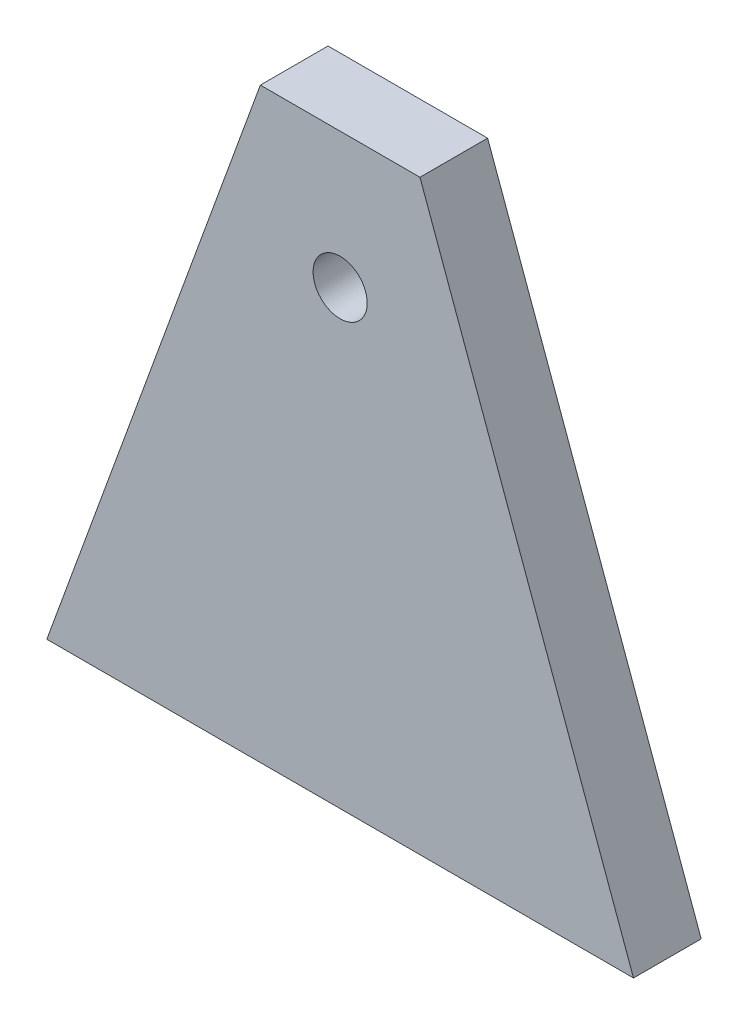
ISO-10303-21;
HEADER;
FILE_DESCRIPTION(('STEP AP214'),'2;1');
FILE_NAME('part.step','',(''),(''),'','','');
FILE_SCHEMA(('AUTOMOTIVE_DESIGN { 1 0 10303 214 1 1 1 1 }'));
ENDSEC;
DATA;
#1=APPLICATION_CONTEXT('core data for automotive mechanical design processes');
#2=APPLICATION_PROTOCOL_DEFINITION('international standard','automotive_design',2000,#1);
#3=PRODUCT_CONTEXT('',#1,'mechanical');
#4=PRODUCT('Part','Part','',(#3));
#5=PRODUCT_RELATED_PRODUCT_CATEGORY('part','',(#4));
#6=PRODUCT_DEFINITION_FORMATION('','',#4);
#7=PRODUCT_DEFINITION_CONTEXT('part definition',#1,'design');
#8=PRODUCT_DEFINITION('design','',#6,#7);
#9=PRODUCT_DEFINITION_SHAPE('','',#8);
#10=(LENGTH_UNIT() NAMED_UNIT(*) SI_UNIT(.MILLI.,.METRE.));
#11=(NAMED_UNIT(*) PLANE_ANGLE_UNIT() SI_UNIT($,.RADIAN.));
#12=(NAMED_UNIT(*) SI_UNIT($,.STERADIAN.) SOLID_ANGLE_UNIT());
#13=UNCERTAINTY_MEASURE_WITH_UNIT(LENGTH_MEASURE(1.E-05),#10,'distance_accuracy_value','');
#14=(GEOMETRIC_REPRESENTATION_CONTEXT(3) GLOBAL_UNCERTAINTY_ASSIGNED_CONTEXT((#13)) GLOBAL_UNIT_ASSIGNED_CONTEXT((#10,
#11,#12)) REPRESENTATION_CONTEXT('',''));
#15=CARTESIAN_POINT('',(0.,0.,0.));
#16=DIRECTION('',(0.,0.,1.));
#17=DIRECTION('',(1.,0.,0.));
#18=AXIS2_PLACEMENT_3D('',#15,#16,#17);
#19=CARTESIAN_POINT('',(47.3161304546069,130.,15.));
#20=DIRECTION('',(0.939692620785907,-0.342020143325673,0.));
#21=DIRECTION('',(0.342020143325673,0.939692620785907,0.));
#22=AXIS2_PLACEMENT_3D('',#19,#20,#21);
#23=PLANE('',#22);
#24=DIRECTION('',(-0.342020143325673,-0.939692620785907,0.));
#25=VECTOR('',#24,1.);
#26=CARTESIAN_POINT('',(47.3161304546069,130.,0.));
#27=LINE('',#26,#25);
#28=CARTESIAN_POINT('',(47.3161304546069,130.,0.));
#29=VERTEX_POINT('',#28);
#30=CARTESIAN_POINT('',(0.,0.,0.));
#31=VERTEX_POINT('',#30);
#32=EDGE_CURVE('E95',#29,#31,#27,.T.);
#33=ORIENTED_EDGE('',*,*,#32,.T.);
#34=DIRECTION('',(0.,0.,-1.));
#35=VECTOR('',#34,1.);
#36=CARTESIAN_POINT('',(0.,0.,15.));
#37=LINE('',#36,#35);
#38=CARTESIAN_POINT('',(0.,0.,15.));
#39=VERTEX_POINT('',#38);
#40=EDGE_CURVE('E11',#39,#31,#37,.T.);
#41=ORIENTED_EDGE('',*,*,#40,.F.);
#42=DIRECTION('',(-0.342020143325673,-0.939692620785907,0.));
#43=VECTOR('',#42,1.);
#44=CARTESIAN_POINT('',(47.3161304546069,130.,15.));
#45=LINE('',#44,#43);
#46=CARTESIAN_POINT('',(47.3161304546069,130.,15.));
#47=VERTEX_POINT('',#46);
#48=EDGE_CURVE('E83',#47,#39,#45,.T.);
#49=ORIENTED_EDGE('',*,*,#48,.F.);
#50=DIRECTION('',(0.,0.,-1.));
#51=VECTOR('',#50,1.);
#52=CARTESIAN_POINT('',(47.3161304546069,130.,15.));
#53=LINE('',#52,#51);
#54=EDGE_CURVE('E91',#47,#29,#53,.T.);
#55=ORIENTED_EDGE('',*,*,#54,.T.);
#56=EDGE_LOOP('',(#33,#41,#49,#55));
#57=FACE_BOUND('',#56,.T.);
#58=ADVANCED_FACE('F32',(#57),#23,.F.);
#59=CARTESIAN_POINT('',(0.,0.,15.));
#60=DIRECTION('',(0.,1.,0.));
#61=DIRECTION('',(0.,0.,1.));
#62=AXIS2_PLACEMENT_3D('',#59,#60,#61);
#63=PLANE('',#62);
#64=DIRECTION('',(1.,0.,0.));
#65=VECTOR('',#64,1.);
#66=CARTESIAN_POINT('',(0.,0.,0.));
#67=LINE('',#66,#65);
#68=CARTESIAN_POINT('',(130.,0.,0.));
#69=VERTEX_POINT('',#68);
#70=EDGE_CURVE('E87',#31,#69,#67,.T.);
#71=ORIENTED_EDGE('',*,*,#70,.T.);
#72=DIRECTION('',(0.,0.,-1.));
#73=VECTOR('',#72,1.);
#74=CARTESIAN_POINT('',(130.,0.,15.));
#75=LINE('',#74,#73);
#76=CARTESIAN_POINT('',(130.,0.,15.));
#77=VERTEX_POINT('',#76);
#78=EDGE_CURVE('E40',#77,#69,#75,.T.);
#79=ORIENTED_EDGE('',*,*,#78,.F.);
#80=DIRECTION('',(1.,0.,0.));
#81=VECTOR('',#80,1.);
#82=CARTESIAN_POINT('',(0.,0.,15.));
#83=LINE('',#82,#81);
#84=EDGE_CURVE('E78',#39,#77,#83,.T.);
#85=ORIENTED_EDGE('',*,*,#84,.F.);
#86=ORIENTED_EDGE('',*,*,#40,.T.);
#87=EDGE_LOOP('',(#71,#79,#85,#86));
#88=FACE_BOUND('',#87,.T.);
#89=ADVANCED_FACE('F86',(#88),#63,.F.);
#90=CARTESIAN_POINT('',(130.,0.,15.));
#91=DIRECTION('',(-0.939692620785907,-0.342020143325673,0.));
#92=DIRECTION('',(0.342020143325673,-0.939692620785907,0.));
#93=AXIS2_PLACEMENT_3D('',#90,#91,#92);
#94=PLANE('',#93);
#95=DIRECTION('',(-0.342020143325673,0.939692620785907,0.));
#96=VECTOR('',#95,1.);
#97=CARTESIAN_POINT('',(130.,0.,0.));
#98=LINE('',#97,#96);
#99=CARTESIAN_POINT('',(82.6838695453931,130.,0.));
#100=VERTEX_POINT('',#99);
#101=EDGE_CURVE('E65',#69,#100,#98,.T.);
#102=ORIENTED_EDGE('',*,*,#101,.T.);
#103=DIRECTION('',(0.,0.,-1.));
#104=VECTOR('',#103,1.);
#105=CARTESIAN_POINT('',(82.6838695453931,130.,15.));
#106=LINE('',#105,#104);
#107=CARTESIAN_POINT('',(82.6838695453931,130.,15.));
#108=VERTEX_POINT('',#107);
#109=EDGE_CURVE('E88',#108,#100,#106,.T.);
#110=ORIENTED_EDGE('',*,*,#109,.F.);
#111=DIRECTION('',(-0.342020143325673,0.939692620785907,0.));
#112=VECTOR('',#111,1.);
#113=CARTESIAN_POINT('',(130.,0.,15.));
#114=LINE('',#113,#112);
#115=EDGE_CURVE('E81',#77,#108,#114,.T.);
#116=ORIENTED_EDGE('',*,*,#115,.F.);
#117=ORIENTED_EDGE('',*,*,#78,.T.);
#118=EDGE_LOOP('',(#102,#110,#116,#117));
#119=FACE_BOUND('',#118,.T.);
#120=ADVANCED_FACE('F89',(#119),#94,.F.);
#121=CARTESIAN_POINT('',(82.6838695453931,130.,15.));
#122=DIRECTION('',(0.,-1.,0.));
#123=DIRECTION('',(0.,0.,-1.));
#124=AXIS2_PLACEMENT_3D('',#121,#122,#123);
#125=PLANE('',#124);
#126=DIRECTION('',(-1.,0.,0.));
#127=VECTOR('',#126,1.);
#128=CARTESIAN_POINT('',(82.6838695453931,130.,0.));
#129=LINE('',#128,#127);
#130=EDGE_CURVE('E71',#100,#29,#129,.T.);
#131=ORIENTED_EDGE('',*,*,#130,.T.);
#132=ORIENTED_EDGE('',*,*,#54,.F.);
#133=DIRECTION('',(-1.,0.,0.));
#134=VECTOR('',#133,1.);
#135=CARTESIAN_POINT('',(82.6838695453931,130.,15.));
#136=LINE('',#135,#134);
#137=EDGE_CURVE('E48',#108,#47,#136,.T.);
#138=ORIENTED_EDGE('',*,*,#137,.F.);
#139=ORIENTED_EDGE('',*,*,#109,.T.);
#140=EDGE_LOOP('',(#131,#132,#138,#139));
#141=FACE_BOUND('',#140,.T.);
#142=ADVANCED_FACE('F103',(#141),#125,.F.);
#143=CARTESIAN_POINT('',(0.,0.,15.));
#144=DIRECTION('',(0.,0.,1.));
#145=DIRECTION('',(1.,0.,0.));
#146=AXIS2_PLACEMENT_3D('',#143,#144,#145);
#147=PLANE('',#146);
#148=CARTESIAN_POINT('',(65.,100.,15.));
#149=DIRECTION('',(0.,0.,1.));
#150=DIRECTION('',(1.,0.,0.));
#151=AXIS2_PLACEMENT_3D('',#148,#149,#150);
#152=CIRCLE('',#151,6.);
#153=CARTESIAN_POINT('',(71.,100.,15.));
#154=VERTEX_POINT('',#153);
#155=EDGE_CURVE('E109',#154,#154,#152,.T.);
#156=ORIENTED_EDGE('',*,*,#155,.F.);
#157=EDGE_LOOP('',(#156));
#158=FACE_BOUND('',#157,.T.);
#159=ORIENTED_EDGE('',*,*,#48,.T.);
#160=ORIENTED_EDGE('',*,*,#84,.T.);
#161=ORIENTED_EDGE('',*,*,#115,.T.);
#162=ORIENTED_EDGE('',*,*,#137,.T.);
#163=EDGE_LOOP('',(#159,#160,#161,#162));
#164=FACE_BOUND('',#163,.T.);
#165=ADVANCED_FACE('F79',(#158,#164),#147,.T.);
#166=CARTESIAN_POINT('',(0.,0.,0.));
#167=DIRECTION('',(0.,0.,1.));
#168=DIRECTION('',(1.,0.,0.));
#169=AXIS2_PLACEMENT_3D('',#166,#167,#168);
#170=PLANE('',#169);
#171=CARTESIAN_POINT('',(65.,100.,0.));
#172=DIRECTION('',(0.,0.,1.));
#173=DIRECTION('',(1.,0.,0.));
#174=AXIS2_PLACEMENT_3D('',#171,#172,#173);
#175=CIRCLE('',#174,6.);
#176=CARTESIAN_POINT('',(71.,100.,0.));
#177=VERTEX_POINT('',#176);
#178=EDGE_CURVE('E98',#177,#177,#175,.T.);
#179=ORIENTED_EDGE('',*,*,#178,.T.);
#180=EDGE_LOOP('',(#179));
#181=FACE_BOUND('',#180,.T.);
#182=ORIENTED_EDGE('',*,*,#32,.F.);
#183=ORIENTED_EDGE('',*,*,#130,.F.);
#184=ORIENTED_EDGE('',*,*,#101,.F.);
#185=ORIENTED_EDGE('',*,*,#70,.F.);
#186=EDGE_LOOP('',(#182,#183,#184,#185));
#187=FACE_BOUND('',#186,.T.);
#188=ADVANCED_FACE('F106',(#181,#187),#170,.F.);
#189=CARTESIAN_POINT('',(65.,100.,0.));
#190=DIRECTION('',(0.,0.,1.));
#191=DIRECTION('',(1.,0.,0.));
#192=AXIS2_PLACEMENT_3D('',#189,#190,#191);
#193=CYLINDRICAL_SURFACE('',#192,6.);
#194=ORIENTED_EDGE('',*,*,#178,.F.);
#195=EDGE_LOOP('',(#194));
#196=FACE_BOUND('',#195,.T.);
#197=ORIENTED_EDGE('',*,*,#155,.T.);
#198=EDGE_LOOP('',(#197));
#199=FACE_BOUND('',#198,.T.);
#200=ADVANCED_FACE('F116',(#196,#199),#193,.F.);
#201=CLOSED_SHELL('',(#58,#89,#120,#142,#165,#188,#200));
#202=MANIFOLD_SOLID_BREP('B2',#201);
#203=ADVANCED_BREP_SHAPE_REPRESENTATION('',(#18,#202),#14);
#204=SHAPE_DEFINITION_REPRESENTATION(#9,#203);
ENDSEC;
END-ISO-10303-21;
